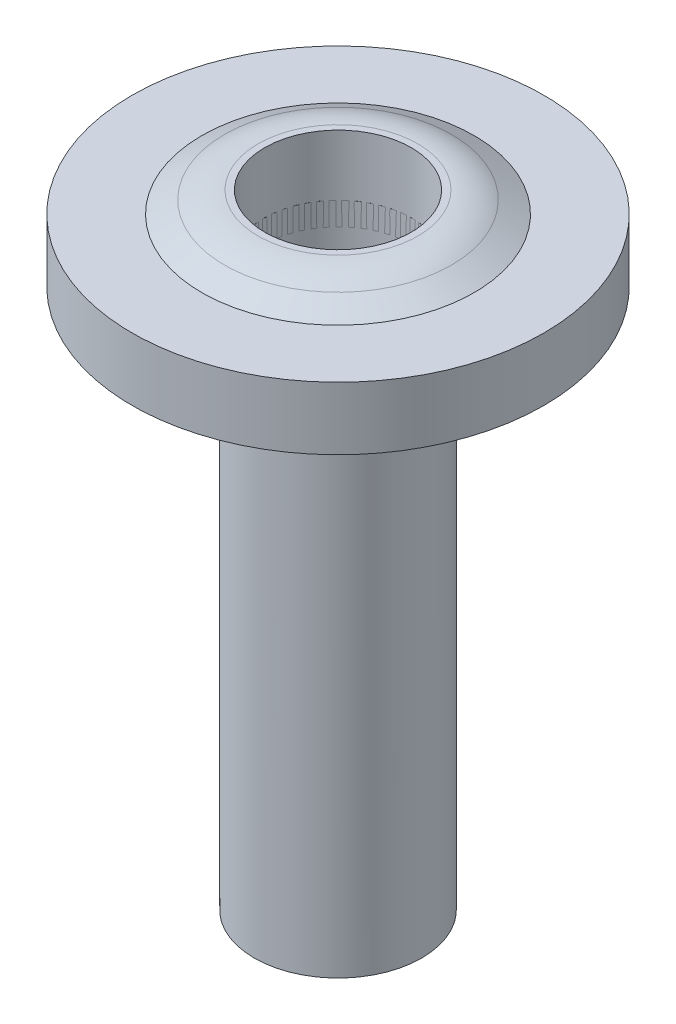
ISO-10303-21;
HEADER;
FILE_DESCRIPTION(('STEP AP214'),'2;1');
FILE_NAME('part.step','',(''),(''),'','','');
FILE_SCHEMA(('AUTOMOTIVE_DESIGN { 1 0 10303 214 1 1 1 1 }'));
ENDSEC;
DATA;
#1=APPLICATION_CONTEXT('core data for automotive mechanical design processes');
#2=APPLICATION_PROTOCOL_DEFINITION('international standard','automotive_design',2000,#1);
#3=PRODUCT_CONTEXT('',#1,'mechanical');
#4=PRODUCT('Part','Part','',(#3));
#5=PRODUCT_RELATED_PRODUCT_CATEGORY('part','',(#4));
#6=PRODUCT_DEFINITION_FORMATION('','',#4);
#7=PRODUCT_DEFINITION_CONTEXT('part definition',#1,'design');
#8=PRODUCT_DEFINITION('design','',#6,#7);
#9=PRODUCT_DEFINITION_SHAPE('','',#8);
#10=(LENGTH_UNIT() NAMED_UNIT(*) SI_UNIT(.MILLI.,.METRE.));
#11=(NAMED_UNIT(*) PLANE_ANGLE_UNIT() SI_UNIT($,.RADIAN.));
#12=(NAMED_UNIT(*) SI_UNIT($,.STERADIAN.) SOLID_ANGLE_UNIT());
#13=UNCERTAINTY_MEASURE_WITH_UNIT(LENGTH_MEASURE(1.E-05),#10,'distance_accuracy_value','');
#14=(GEOMETRIC_REPRESENTATION_CONTEXT(3) GLOBAL_UNCERTAINTY_ASSIGNED_CONTEXT((#13)) GLOBAL_UNIT_ASSIGNED_CONTEXT((#10,
#11,#12)) REPRESENTATION_CONTEXT('',''));
#15=CARTESIAN_POINT('',(0.,0.,0.));
#16=DIRECTION('',(0.,0.,1.));
#17=DIRECTION('',(1.,0.,0.));
#18=AXIS2_PLACEMENT_3D('',#15,#16,#17);
#19=CARTESIAN_POINT('',(0.,82.,0.));
#20=DIRECTION('',(0.,-1.,0.));
#21=DIRECTION('',(1.,0.,0.));
#22=AXIS2_PLACEMENT_3D('',#19,#20,#21);
#23=PLANE('',#22);
#24=CARTESIAN_POINT('',(0.,82.,0.));
#25=DIRECTION('',(0.,1.,0.));
#26=DIRECTION('',(-1.,0.,0.));
#27=AXIS2_PLACEMENT_3D('',#24,#25,#26);
#28=CIRCLE('',#27,10.5);
#29=CARTESIAN_POINT('',(-10.5,82.,0.));
#30=VERTEX_POINT('',#29);
#31=EDGE_CURVE('E83',#30,#30,#28,.T.);
#32=ORIENTED_EDGE('',*,*,#31,.F.);
#33=EDGE_LOOP('',(#32));
#34=FACE_BOUND('',#33,.T.);
#35=CARTESIAN_POINT('',(0.,82.,0.));
#36=DIRECTION('',(0.,1.,0.));
#37=DIRECTION('',(-1.,0.,0.));
#38=AXIS2_PLACEMENT_3D('',#35,#36,#37);
#39=CIRCLE('',#38,11.4500598564305);
#40=CARTESIAN_POINT('',(-11.4500598564305,82.,0.));
#41=VERTEX_POINT('',#40);
#42=EDGE_CURVE('E11',#41,#41,#39,.T.);
#43=ORIENTED_EDGE('',*,*,#42,.T.);
#44=EDGE_LOOP('',(#43));
#45=FACE_BOUND('',#44,.T.);
#46=ADVANCED_FACE('F55',(#34,#45),#23,.F.);
#47=CARTESIAN_POINT('',(0.,72.,0.));
#48=DIRECTION('',(0.,1.,0.));
#49=DIRECTION('',(-1.,0.,0.));
#50=AXIS2_PLACEMENT_3D('',#47,#48,#49);
#51=TOROIDAL_SURFACE('',#50,11.4500598564305,9.99999999999999);
#52=ORIENTED_EDGE('',*,*,#42,.F.);
#53=EDGE_LOOP('',(#52));
#54=FACE_BOUND('',#53,.T.);
#55=CARTESIAN_POINT('',(0.,80.7789557291438,0.));
#56=DIRECTION('',(0.,1.,0.));
#57=DIRECTION('',(-1.,0.,0.));
#58=AXIS2_PLACEMENT_3D('',#55,#56,#57);
#59=CIRCLE('',#58,16.2385811632363);
#60=CARTESIAN_POINT('',(-16.2385811632363,80.7789557291438,0.));
#61=VERTEX_POINT('',#60);
#62=EDGE_CURVE('E64',#61,#61,#59,.T.);
#63=ORIENTED_EDGE('',*,*,#62,.T.);
#64=EDGE_LOOP('',(#63));
#65=FACE_BOUND('',#64,.T.);
#66=ADVANCED_FACE('F112',(#54,#65),#51,.T.);
#67=CARTESIAN_POINT('',(0.,79.,0.));
#68=DIRECTION('',(0.,-1.,0.));
#69=DIRECTION('',(1.,0.,0.));
#70=AXIS2_PLACEMENT_3D('',#67,#68,#69);
#71=CONICAL_SURFACE('',#70,19.5,1.07144960511477);
#72=ORIENTED_EDGE('',*,*,#62,.F.);
#73=EDGE_LOOP('',(#72));
#74=FACE_BOUND('',#73,.T.);
#75=CARTESIAN_POINT('',(0.,79.,0.));
#76=DIRECTION('',(0.,1.,0.));
#77=DIRECTION('',(-1.,0.,0.));
#78=AXIS2_PLACEMENT_3D('',#75,#76,#77);
#79=CIRCLE('',#78,19.5);
#80=CARTESIAN_POINT('',(-19.5,79.,0.));
#81=VERTEX_POINT('',#80);
#82=EDGE_CURVE('E69',#81,#81,#79,.T.);
#83=ORIENTED_EDGE('',*,*,#82,.T.);
#84=EDGE_LOOP('',(#83));
#85=FACE_BOUND('',#84,.T.);
#86=ADVANCED_FACE('F107',(#74,#85),#71,.T.);
#87=CARTESIAN_POINT('',(29.5,79.,0.));
#88=DIRECTION('',(0.,-1.,0.));
#89=DIRECTION('',(1.,0.,0.));
#90=AXIS2_PLACEMENT_3D('',#87,#88,#89);
#91=PLANE('',#90);
#92=ORIENTED_EDGE('',*,*,#82,.F.);
#93=EDGE_LOOP('',(#92));
#94=FACE_BOUND('',#93,.T.);
#95=CARTESIAN_POINT('',(0.,79.,0.));
#96=DIRECTION('',(0.,1.,0.));
#97=DIRECTION('',(-1.,0.,0.));
#98=AXIS2_PLACEMENT_3D('',#95,#96,#97);
#99=CIRCLE('',#98,29.5);
#100=CARTESIAN_POINT('',(-29.5,79.,0.));
#101=VERTEX_POINT('',#100);
#102=EDGE_CURVE('E75',#101,#101,#99,.T.);
#103=ORIENTED_EDGE('',*,*,#102,.T.);
#104=EDGE_LOOP('',(#103));
#105=FACE_BOUND('',#104,.T.);
#106=ADVANCED_FACE('F100',(#94,#105),#91,.F.);
#107=CARTESIAN_POINT('',(0.,82.,0.));
#108=DIRECTION('',(0.,1.,0.));
#109=DIRECTION('',(-1.,0.,0.));
#110=AXIS2_PLACEMENT_3D('',#107,#108,#109);
#111=CYLINDRICAL_SURFACE('',#110,29.5);
#112=ORIENTED_EDGE('',*,*,#102,.F.);
#113=EDGE_LOOP('',(#112));
#114=FACE_BOUND('',#113,.T.);
#115=CARTESIAN_POINT('',(0.,70.,0.));
#116=DIRECTION('',(0.,1.,0.));
#117=DIRECTION('',(-1.,0.,0.));
#118=AXIS2_PLACEMENT_3D('',#115,#116,#117);
#119=CIRCLE('',#118,29.5);
#120=CARTESIAN_POINT('',(-29.5,70.,0.));
#121=VERTEX_POINT('',#120);
#122=EDGE_CURVE('E79',#121,#121,#119,.T.);
#123=ORIENTED_EDGE('',*,*,#122,.T.);
#124=EDGE_LOOP('',(#123));
#125=FACE_BOUND('',#124,.T.);
#126=ADVANCED_FACE('F96',(#114,#125),#111,.T.);
#127=CARTESIAN_POINT('',(28.5,70.,0.));
#128=DIRECTION('',(0.,-1.,0.));
#129=DIRECTION('',(0.,0.,-1.));
#130=AXIS2_PLACEMENT_3D('',#127,#128,#129);
#131=PLANE('',#130);
#132=CARTESIAN_POINT('',(0.,70.,0.));
#133=DIRECTION('',(0.,-1.,0.));
#134=DIRECTION('',(0.,0.,-1.));
#135=AXIS2_PLACEMENT_3D('',#132,#133,#134);
#136=CIRCLE('',#135,10.5);
#137=CARTESIAN_POINT('',(0.,70.,-10.5));
#138=VERTEX_POINT('',#137);
#139=EDGE_CURVE('E59',#138,#138,#136,.T.);
#140=ORIENTED_EDGE('',*,*,#139,.F.);
#141=EDGE_LOOP('',(#140));
#142=FACE_BOUND('',#141,.T.);
#143=ORIENTED_EDGE('',*,*,#122,.F.);
#144=EDGE_LOOP('',(#143));
#145=FACE_BOUND('',#144,.T.);
#146=ADVANCED_FACE('F57',(#142,#145),#131,.T.);
#147=CARTESIAN_POINT('',(0.,0.,0.));
#148=DIRECTION('',(0.,1.,0.));
#149=DIRECTION('',(-1.,0.,0.));
#150=AXIS2_PLACEMENT_3D('',#147,#148,#149);
#151=CYLINDRICAL_SURFACE('',#150,10.5);
#152=ORIENTED_EDGE('',*,*,#139,.T.);
#153=EDGE_LOOP('',(#152));
#154=FACE_BOUND('',#153,.T.);
#155=ORIENTED_EDGE('',*,*,#31,.T.);
#156=EDGE_LOOP('',(#155));
#157=FACE_BOUND('',#156,.T.);
#158=ADVANCED_FACE('F92',(#154,#157),#151,.F.);
#159=CLOSED_SHELL('',(#46,#66,#86,#106,#126,#146,#158));
#160=MANIFOLD_SOLID_BREP('B2',#159);
#161=CARTESIAN_POINT('',(0.,73.3,0.));
#162=DIRECTION('',(0.,1.,0.));
#163=DIRECTION('',(-1.,0.,0.));
#164=AXIS2_PLACEMENT_3D('',#161,#162,#163);
#165=CYLINDRICAL_SURFACE('',#164,12.);
#166=CARTESIAN_POINT('',(0.,69.3,0.));
#167=DIRECTION('',(0.,1.,0.));
#168=DIRECTION('',(-1.,0.,0.));
#169=AXIS2_PLACEMENT_3D('',#166,#167,#168);
#170=CIRCLE('',#169,12.);
#171=CARTESIAN_POINT('',(-12.,69.3,0.));
#172=VERTEX_POINT('',#171);
#173=EDGE_CURVE('E54',#172,#172,#170,.T.);
#174=ORIENTED_EDGE('',*,*,#173,.F.);
#175=EDGE_LOOP('',(#174));
#176=FACE_BOUND('',#175,.T.);
#177=CARTESIAN_POINT('',(0.,-7.3,0.));
#178=DIRECTION('',(0.,-1.,0.));
#179=DIRECTION('',(1.,0.,0.));
#180=AXIS2_PLACEMENT_3D('',#177,#178,#179);
#181=CIRCLE('',#180,12.);
#182=CARTESIAN_POINT('',(12.,-7.3,0.));
#183=VERTEX_POINT('',#182);
#184=EDGE_CURVE('E192',#183,#183,#181,.T.);
#185=ORIENTED_EDGE('',*,*,#184,.F.);
#186=EDGE_LOOP('',(#185));
#187=FACE_BOUND('',#186,.T.);
#188=ADVANCED_FACE('F176',(#176,#187),#165,.T.);
#189=CARTESIAN_POINT('',(12.,69.3,0.));
#190=DIRECTION('',(0.,1.,0.));
#191=DIRECTION('',(-1.,0.,0.));
#192=AXIS2_PLACEMENT_3D('',#189,#190,#191);
#193=PLANE('',#192);
#194=CARTESIAN_POINT('',(0.,69.3,0.));
#195=DIRECTION('',(0.,1.,0.));
#196=DIRECTION('',(-1.,0.,0.));
#197=AXIS2_PLACEMENT_3D('',#194,#195,#196);
#198=CIRCLE('',#197,25.);
#199=CARTESIAN_POINT('',(-25.,69.3,0.));
#200=VERTEX_POINT('',#199);
#201=EDGE_CURVE('E183',#200,#200,#198,.T.);
#202=ORIENTED_EDGE('',*,*,#201,.F.);
#203=EDGE_LOOP('',(#202));
#204=FACE_BOUND('',#203,.T.);
#205=ORIENTED_EDGE('',*,*,#173,.T.);
#206=EDGE_LOOP('',(#205));
#207=FACE_BOUND('',#206,.T.);
#208=ADVANCED_FACE('F212',(#204,#207),#193,.F.);
#209=CARTESIAN_POINT('',(0.,73.3,0.));
#210=DIRECTION('',(0.,1.,0.));
#211=DIRECTION('',(-1.,0.,0.));
#212=AXIS2_PLACEMENT_3D('',#209,#210,#211);
#213=CYLINDRICAL_SURFACE('',#212,25.);
#214=CARTESIAN_POINT('',(0.,73.3,0.));
#215=DIRECTION('',(0.,1.,0.));
#216=DIRECTION('',(-1.,0.,0.));
#217=AXIS2_PLACEMENT_3D('',#214,#215,#216);
#218=CIRCLE('',#217,25.);
#219=CARTESIAN_POINT('',(-25.,73.3,0.));
#220=VERTEX_POINT('',#219);
#221=EDGE_CURVE('E187',#220,#220,#218,.T.);
#222=ORIENTED_EDGE('',*,*,#221,.F.);
#223=EDGE_LOOP('',(#222));
#224=FACE_BOUND('',#223,.T.);
#225=ORIENTED_EDGE('',*,*,#201,.T.);
#226=EDGE_LOOP('',(#225));
#227=FACE_BOUND('',#226,.T.);
#228=ADVANCED_FACE('F218',(#224,#227),#213,.T.);
#229=CARTESIAN_POINT('',(25.,73.3,0.));
#230=DIRECTION('',(0.,-1.,0.));
#231=DIRECTION('',(1.,0.,0.));
#232=AXIS2_PLACEMENT_3D('',#229,#230,#231);
#233=PLANE('',#232);
#234=CARTESIAN_POINT('',(0.,73.3,0.));
#235=DIRECTION('',(0.,-1.,0.));
#236=DIRECTION('',(1.,0.,0.));
#237=AXIS2_PLACEMENT_3D('',#234,#235,#236);
#238=CIRCLE('',#237,10.5);
#239=CARTESIAN_POINT('',(10.5,73.3,0.));
#240=VERTEX_POINT('',#239);
#241=EDGE_CURVE('E179',#240,#240,#238,.T.);
#242=ORIENTED_EDGE('',*,*,#241,.T.);
#243=EDGE_LOOP('',(#242));
#244=FACE_BOUND('',#243,.T.);
#245=ORIENTED_EDGE('',*,*,#221,.T.);
#246=EDGE_LOOP('',(#245));
#247=FACE_BOUND('',#246,.T.);
#248=ADVANCED_FACE('F208',(#244,#247),#233,.F.);
#249=CARTESIAN_POINT('',(0.,0.,0.));
#250=DIRECTION('',(0.,1.,0.));
#251=DIRECTION('',(-1.,0.,0.));
#252=AXIS2_PLACEMENT_3D('',#249,#250,#251);
#253=CYLINDRICAL_SURFACE('',#252,10.5);
#254=ORIENTED_EDGE('',*,*,#241,.F.);
#255=EDGE_LOOP('',(#254));
#256=FACE_BOUND('',#255,.T.);
#257=CARTESIAN_POINT('',(0.,-7.3,0.));
#258=DIRECTION('',(0.,-1.,0.));
#259=DIRECTION('',(1.,0.,0.));
#260=AXIS2_PLACEMENT_3D('',#257,#258,#259);
#261=CIRCLE('',#260,10.5);
#262=CARTESIAN_POINT('',(10.5,-7.3,0.));
#263=VERTEX_POINT('',#262);
#264=EDGE_CURVE('E195',#263,#263,#261,.T.);
#265=ORIENTED_EDGE('',*,*,#264,.T.);
#266=EDGE_LOOP('',(#265));
#267=FACE_BOUND('',#266,.T.);
#268=ADVANCED_FACE('F199',(#256,#267),#253,.F.);
#269=CARTESIAN_POINT('',(0.,-7.3,0.));
#270=DIRECTION('',(0.,-1.,0.));
#271=DIRECTION('',(1.,0.,0.));
#272=AXIS2_PLACEMENT_3D('',#269,#270,#271);
#273=PLANE('',#272);
#274=ORIENTED_EDGE('',*,*,#184,.T.);
#275=EDGE_LOOP('',(#274));
#276=FACE_BOUND('',#275,.T.);
#277=ORIENTED_EDGE('',*,*,#264,.F.);
#278=EDGE_LOOP('',(#277));
#279=FACE_BOUND('',#278,.T.);
#280=ADVANCED_FACE('F201',(#276,#279),#273,.T.);
#281=CLOSED_SHELL('',(#188,#208,#228,#248,#268,#280));
#282=MANIFOLD_SOLID_BREP('B6',#281);
#283=ADVANCED_BREP_SHAPE_REPRESENTATION('',(#18,#160,#282),#14);
#284=SHAPE_DEFINITION_REPRESENTATION(#9,#283);
ENDSEC;
END-ISO-10303-21;
